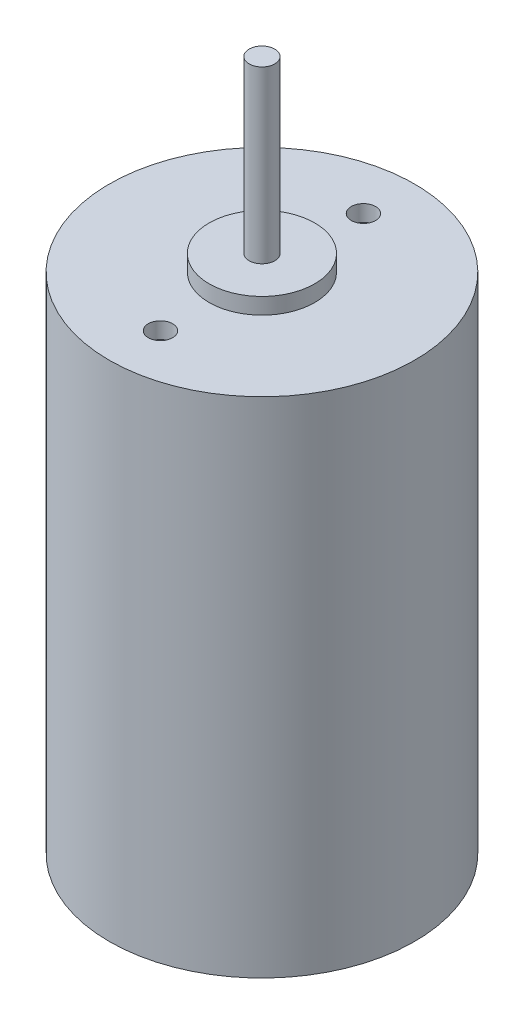
ISO-10303-21;
HEADER;
FILE_DESCRIPTION(('STEP AP214'),'2;1');
FILE_NAME('part.step','',(''),(''),'','','');
FILE_SCHEMA(('AUTOMOTIVE_DESIGN { 1 0 10303 214 1 1 1 1 }'));
ENDSEC;
DATA;
#1=APPLICATION_CONTEXT('core data for automotive mechanical design processes');
#2=APPLICATION_PROTOCOL_DEFINITION('international standard','automotive_design',2000,#1);
#3=PRODUCT_CONTEXT('',#1,'mechanical');
#4=PRODUCT('Part','Part','',(#3));
#5=PRODUCT_RELATED_PRODUCT_CATEGORY('part','',(#4));
#6=PRODUCT_DEFINITION_FORMATION('','',#4);
#7=PRODUCT_DEFINITION_CONTEXT('part definition',#1,'design');
#8=PRODUCT_DEFINITION('design','',#6,#7);
#9=PRODUCT_DEFINITION_SHAPE('','',#8);
#10=(LENGTH_UNIT() NAMED_UNIT(*) SI_UNIT(.MILLI.,.METRE.));
#11=(NAMED_UNIT(*) PLANE_ANGLE_UNIT() SI_UNIT($,.RADIAN.));
#12=(NAMED_UNIT(*) SI_UNIT($,.STERADIAN.) SOLID_ANGLE_UNIT());
#13=UNCERTAINTY_MEASURE_WITH_UNIT(LENGTH_MEASURE(1.E-05),#10,'distance_accuracy_value','');
#14=(GEOMETRIC_REPRESENTATION_CONTEXT(3) GLOBAL_UNCERTAINTY_ASSIGNED_CONTEXT((#13)) GLOBAL_UNIT_ASSIGNED_CONTEXT((#10,
#11,#12)) REPRESENTATION_CONTEXT('',''));
#15=CARTESIAN_POINT('',(0.,0.,0.));
#16=DIRECTION('',(0.,0.,1.));
#17=DIRECTION('',(1.,0.,0.));
#18=AXIS2_PLACEMENT_3D('',#15,#16,#17);
#19=CARTESIAN_POINT('',(0.,-62.,0.));
#20=DIRECTION('',(0.,1.,0.));
#21=DIRECTION('',(0.,0.,1.));
#22=AXIS2_PLACEMENT_3D('',#19,#20,#21);
#23=CYLINDRICAL_SURFACE('',#22,18.80108);
#24=CARTESIAN_POINT('',(0.,-62.,0.));
#25=DIRECTION('',(0.,1.,0.));
#26=DIRECTION('',(0.,0.,1.));
#27=AXIS2_PLACEMENT_3D('',#24,#25,#26);
#28=CIRCLE('',#27,18.80108);
#29=CARTESIAN_POINT('',(0.,-62.,18.80108));
#30=VERTEX_POINT('',#29);
#31=EDGE_CURVE('E10',#30,#30,#28,.T.);
#32=ORIENTED_EDGE('',*,*,#31,.T.);
#33=EDGE_LOOP('',(#32));
#34=FACE_BOUND('',#33,.T.);
#35=CARTESIAN_POINT('',(0.,0.,0.));
#36=DIRECTION('',(0.,1.,0.));
#37=DIRECTION('',(0.,0.,1.));
#38=AXIS2_PLACEMENT_3D('',#35,#36,#37);
#39=CIRCLE('',#38,18.80108);
#40=CARTESIAN_POINT('',(0.,0.,18.80108));
#41=VERTEX_POINT('',#40);
#42=EDGE_CURVE('E43',#41,#41,#39,.T.);
#43=ORIENTED_EDGE('',*,*,#42,.F.);
#44=EDGE_LOOP('',(#43));
#45=FACE_BOUND('',#44,.T.);
#46=ADVANCED_FACE('F36',(#34,#45),#23,.T.);
#47=CARTESIAN_POINT('',(0.,-62.,0.));
#48=DIRECTION('',(0.,1.,0.));
#49=DIRECTION('',(0.,0.,1.));
#50=AXIS2_PLACEMENT_3D('',#47,#48,#49);
#51=PLANE('',#50);
#52=ORIENTED_EDGE('',*,*,#31,.F.);
#53=EDGE_LOOP('',(#52));
#54=FACE_BOUND('',#53,.T.);
#55=ADVANCED_FACE('F92',(#54),#51,.F.);
#56=CARTESIAN_POINT('',(0.,0.,0.));
#57=DIRECTION('',(0.,1.,0.));
#58=DIRECTION('',(0.,0.,1.));
#59=AXIS2_PLACEMENT_3D('',#56,#57,#58);
#60=PLANE('',#59);
#61=CARTESIAN_POINT('',(0.,0.,0.));
#62=DIRECTION('',(0.,1.,0.));
#63=DIRECTION('',(0.,0.,1.));
#64=AXIS2_PLACEMENT_3D('',#61,#62,#63);
#65=CIRCLE('',#64,6.50000000000001);
#66=CARTESIAN_POINT('',(0.,0.,6.50000000000001));
#67=VERTEX_POINT('',#66);
#68=EDGE_CURVE('E64',#67,#67,#65,.T.);
#69=ORIENTED_EDGE('',*,*,#68,.F.);
#70=EDGE_LOOP('',(#69));
#71=FACE_BOUND('',#70,.T.);
#72=CARTESIAN_POINT('',(0.,0.,-12.5));
#73=DIRECTION('',(0.,1.,0.));
#74=DIRECTION('',(0.,0.,1.));
#75=AXIS2_PLACEMENT_3D('',#72,#73,#74);
#76=CIRCLE('',#75,1.5);
#77=CARTESIAN_POINT('',(0.,0.,-11.));
#78=VERTEX_POINT('',#77);
#79=EDGE_CURVE('E59',#78,#78,#76,.T.);
#80=ORIENTED_EDGE('',*,*,#79,.F.);
#81=EDGE_LOOP('',(#80));
#82=FACE_BOUND('',#81,.T.);
#83=CARTESIAN_POINT('',(0.,0.,12.5));
#84=DIRECTION('',(0.,1.,0.));
#85=DIRECTION('',(0.,0.,1.));
#86=AXIS2_PLACEMENT_3D('',#83,#84,#85);
#87=CIRCLE('',#86,1.5);
#88=CARTESIAN_POINT('',(0.,0.,14.));
#89=VERTEX_POINT('',#88);
#90=EDGE_CURVE('E53',#89,#89,#87,.T.);
#91=ORIENTED_EDGE('',*,*,#90,.F.);
#92=EDGE_LOOP('',(#91));
#93=FACE_BOUND('',#92,.T.);
#94=ORIENTED_EDGE('',*,*,#42,.T.);
#95=EDGE_LOOP('',(#94));
#96=FACE_BOUND('',#95,.T.);
#97=ADVANCED_FACE('F96',(#71,#82,#93,#96),#60,.T.);
#98=CARTESIAN_POINT('',(0.,-2.,12.5));
#99=DIRECTION('',(0.,1.,0.));
#100=DIRECTION('',(0.,0.,1.));
#101=AXIS2_PLACEMENT_3D('',#98,#99,#100);
#102=CYLINDRICAL_SURFACE('',#101,1.5);
#103=CARTESIAN_POINT('',(0.,-2.,12.5));
#104=DIRECTION('',(0.,1.,0.));
#105=DIRECTION('',(0.,0.,1.));
#106=AXIS2_PLACEMENT_3D('',#103,#104,#105);
#107=CIRCLE('',#106,1.5);
#108=CARTESIAN_POINT('',(0.,-2.,14.));
#109=VERTEX_POINT('',#108);
#110=EDGE_CURVE('E56',#109,#109,#107,.T.);
#111=ORIENTED_EDGE('',*,*,#110,.F.);
#112=EDGE_LOOP('',(#111));
#113=FACE_BOUND('',#112,.T.);
#114=ORIENTED_EDGE('',*,*,#90,.T.);
#115=EDGE_LOOP('',(#114));
#116=FACE_BOUND('',#115,.T.);
#117=ADVANCED_FACE('F103',(#113,#116),#102,.F.);
#118=CARTESIAN_POINT('',(0.,-2.,12.5));
#119=DIRECTION('',(0.,1.,0.));
#120=DIRECTION('',(0.,0.,1.));
#121=AXIS2_PLACEMENT_3D('',#118,#119,#120);
#122=PLANE('',#121);
#123=ORIENTED_EDGE('',*,*,#110,.T.);
#124=EDGE_LOOP('',(#123));
#125=FACE_BOUND('',#124,.T.);
#126=ADVANCED_FACE('F108',(#125),#122,.T.);
#127=CARTESIAN_POINT('',(0.,-2.,-12.5));
#128=DIRECTION('',(0.,1.,0.));
#129=DIRECTION('',(0.,0.,1.));
#130=AXIS2_PLACEMENT_3D('',#127,#128,#129);
#131=CYLINDRICAL_SURFACE('',#130,1.5);
#132=CARTESIAN_POINT('',(0.,-2.,-12.5));
#133=DIRECTION('',(0.,1.,0.));
#134=DIRECTION('',(0.,0.,1.));
#135=AXIS2_PLACEMENT_3D('',#132,#133,#134);
#136=CIRCLE('',#135,1.5);
#137=CARTESIAN_POINT('',(0.,-2.,-11.));
#138=VERTEX_POINT('',#137);
#139=EDGE_CURVE('E52',#138,#138,#136,.T.);
#140=ORIENTED_EDGE('',*,*,#139,.F.);
#141=EDGE_LOOP('',(#140));
#142=FACE_BOUND('',#141,.T.);
#143=ORIENTED_EDGE('',*,*,#79,.T.);
#144=EDGE_LOOP('',(#143));
#145=FACE_BOUND('',#144,.T.);
#146=ADVANCED_FACE('F118',(#142,#145),#131,.F.);
#147=CARTESIAN_POINT('',(0.,-2.,-12.5));
#148=DIRECTION('',(0.,1.,0.));
#149=DIRECTION('',(0.,0.,1.));
#150=AXIS2_PLACEMENT_3D('',#147,#148,#149);
#151=PLANE('',#150);
#152=ORIENTED_EDGE('',*,*,#139,.T.);
#153=EDGE_LOOP('',(#152));
#154=FACE_BOUND('',#153,.T.);
#155=ADVANCED_FACE('F88',(#154),#151,.T.);
#156=CARTESIAN_POINT('',(0.,2.,0.));
#157=DIRECTION('',(0.,-1.,0.));
#158=DIRECTION('',(0.,0.,-1.));
#159=AXIS2_PLACEMENT_3D('',#156,#157,#158);
#160=CYLINDRICAL_SURFACE('',#159,6.50000000000001);
#161=CARTESIAN_POINT('',(0.,2.,0.));
#162=DIRECTION('',(0.,1.,0.));
#163=DIRECTION('',(0.,0.,1.));
#164=AXIS2_PLACEMENT_3D('',#161,#162,#163);
#165=CIRCLE('',#164,6.50000000000001);
#166=CARTESIAN_POINT('',(0.,2.,6.50000000000001));
#167=VERTEX_POINT('',#166);
#168=EDGE_CURVE('E67',#167,#167,#165,.T.);
#169=ORIENTED_EDGE('',*,*,#168,.F.);
#170=EDGE_LOOP('',(#169));
#171=FACE_BOUND('',#170,.T.);
#172=ORIENTED_EDGE('',*,*,#68,.T.);
#173=EDGE_LOOP('',(#172));
#174=FACE_BOUND('',#173,.T.);
#175=ADVANCED_FACE('F80',(#171,#174),#160,.T.);
#176=CARTESIAN_POINT('',(0.,2.,0.));
#177=DIRECTION('',(0.,1.,0.));
#178=DIRECTION('',(0.,0.,1.));
#179=AXIS2_PLACEMENT_3D('',#176,#177,#178);
#180=PLANE('',#179);
#181=CARTESIAN_POINT('',(0.,2.,0.));
#182=DIRECTION('',(0.,1.,0.));
#183=DIRECTION('',(0.,0.,1.));
#184=AXIS2_PLACEMENT_3D('',#181,#182,#183);
#185=CIRCLE('',#184,1.58);
#186=CARTESIAN_POINT('',(0.,2.,1.58));
#187=VERTEX_POINT('',#186);
#188=EDGE_CURVE('E39',#187,#187,#185,.T.);
#189=ORIENTED_EDGE('',*,*,#188,.F.);
#190=EDGE_LOOP('',(#189));
#191=FACE_BOUND('',#190,.T.);
#192=ORIENTED_EDGE('',*,*,#168,.T.);
#193=EDGE_LOOP('',(#192));
#194=FACE_BOUND('',#193,.T.);
#195=ADVANCED_FACE('F77',(#191,#194),#180,.T.);
#196=CARTESIAN_POINT('',(0.,23.,0.));
#197=DIRECTION('',(0.,1.,0.));
#198=DIRECTION('',(0.,0.,1.));
#199=AXIS2_PLACEMENT_3D('',#196,#197,#198);
#200=PLANE('',#199);
#201=CARTESIAN_POINT('',(0.,23.,0.));
#202=DIRECTION('',(0.,1.,0.));
#203=DIRECTION('',(0.,0.,1.));
#204=AXIS2_PLACEMENT_3D('',#201,#202,#203);
#205=CIRCLE('',#204,1.58);
#206=CARTESIAN_POINT('',(0.,23.,1.58));
#207=VERTEX_POINT('',#206);
#208=EDGE_CURVE('E48',#207,#207,#205,.T.);
#209=ORIENTED_EDGE('',*,*,#208,.T.);
#210=EDGE_LOOP('',(#209));
#211=FACE_BOUND('',#210,.T.);
#212=ADVANCED_FACE('F79',(#211),#200,.T.);
#213=CARTESIAN_POINT('',(0.,23.,0.));
#214=DIRECTION('',(0.,-1.,0.));
#215=DIRECTION('',(0.,0.,-1.));
#216=AXIS2_PLACEMENT_3D('',#213,#214,#215);
#217=CYLINDRICAL_SURFACE('',#216,1.58);
#218=ORIENTED_EDGE('',*,*,#188,.T.);
#219=EDGE_LOOP('',(#218));
#220=FACE_BOUND('',#219,.T.);
#221=ORIENTED_EDGE('',*,*,#208,.F.);
#222=EDGE_LOOP('',(#221));
#223=FACE_BOUND('',#222,.T.);
#224=ADVANCED_FACE('F74',(#220,#223),#217,.T.);
#225=CLOSED_SHELL('',(#46,#55,#97,#117,#126,#146,#155,#175,#195,#212,#224));
#226=MANIFOLD_SOLID_BREP('B2',#225);
#227=ADVANCED_BREP_SHAPE_REPRESENTATION('',(#18,#226),#14);
#228=SHAPE_DEFINITION_REPRESENTATION(#9,#227);
ENDSEC;
END-ISO-10303-21;
